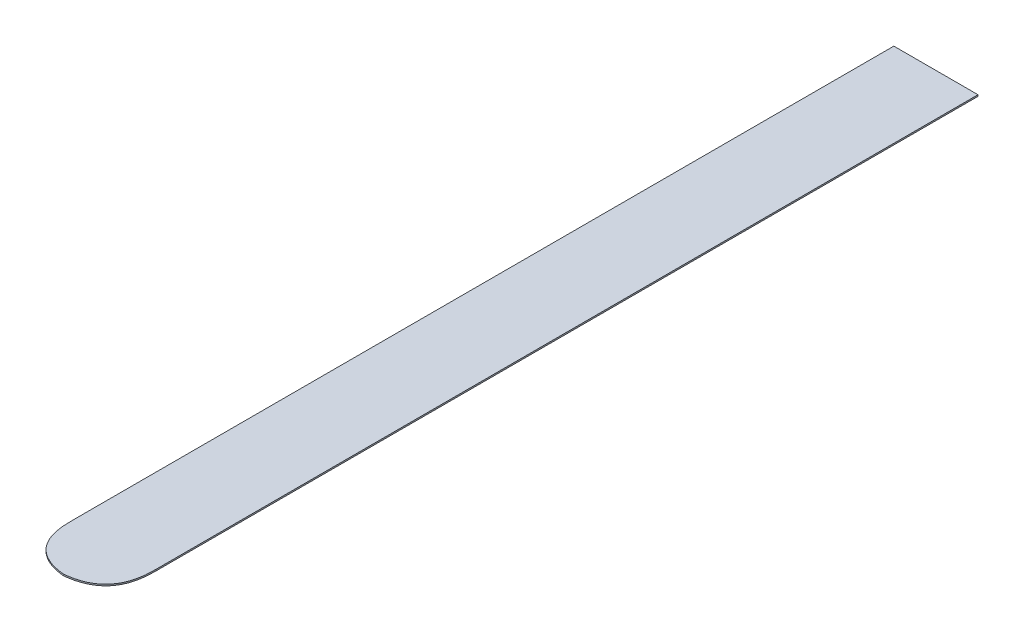
ISO-10303-21;
HEADER;
FILE_DESCRIPTION(('STEP AP214'),'2;1');
FILE_NAME('part.step','',(''),(''),'','','');
FILE_SCHEMA(('AUTOMOTIVE_DESIGN { 1 0 10303 214 1 1 1 1 }'));
ENDSEC;
DATA;
#1=APPLICATION_CONTEXT('core data for automotive mechanical design processes');
#2=APPLICATION_PROTOCOL_DEFINITION('international standard','automotive_design',2000,#1);
#3=PRODUCT_CONTEXT('',#1,'mechanical');
#4=PRODUCT('Part','Part','',(#3));
#5=PRODUCT_RELATED_PRODUCT_CATEGORY('part','',(#4));
#6=PRODUCT_DEFINITION_FORMATION('','',#4);
#7=PRODUCT_DEFINITION_CONTEXT('part definition',#1,'design');
#8=PRODUCT_DEFINITION('design','',#6,#7);
#9=PRODUCT_DEFINITION_SHAPE('','',#8);
#10=(LENGTH_UNIT() NAMED_UNIT(*) SI_UNIT(.MILLI.,.METRE.));
#11=(NAMED_UNIT(*) PLANE_ANGLE_UNIT() SI_UNIT($,.RADIAN.));
#12=(NAMED_UNIT(*) SI_UNIT($,.STERADIAN.) SOLID_ANGLE_UNIT());
#13=UNCERTAINTY_MEASURE_WITH_UNIT(LENGTH_MEASURE(1.E-05),#10,'distance_accuracy_value','');
#14=(GEOMETRIC_REPRESENTATION_CONTEXT(3) GLOBAL_UNCERTAINTY_ASSIGNED_CONTEXT((#13)) GLOBAL_UNIT_ASSIGNED_CONTEXT((#10,
#11,#12)) REPRESENTATION_CONTEXT('',''));
#15=CARTESIAN_POINT('',(0.,0.,0.));
#16=DIRECTION('',(0.,0.,1.));
#17=DIRECTION('',(1.,0.,0.));
#18=AXIS2_PLACEMENT_3D('',#15,#16,#17);
#19=CARTESIAN_POINT('',(2194.56,76.2,-10955.1842125681));
#20=DIRECTION('',(1.,0.,0.));
#21=DIRECTION('',(0.,0.,-1.));
#22=AXIS2_PLACEMENT_3D('',#19,#20,#21);
#23=PLANE('',#22);
#24=DIRECTION('',(0.,0.,1.));
#25=VECTOR('',#24,1.);
#26=CARTESIAN_POINT('',(2194.56,0.,-10955.1842125681));
#27=LINE('',#26,#25);
#28=CARTESIAN_POINT('',(2194.56,0.,-10955.1842125681));
#29=VERTEX_POINT('',#28);
#30=CARTESIAN_POINT('',(2194.56000000001,0.,31899.6957874319));
#31=VERTEX_POINT('',#30);
#32=EDGE_CURVE('E139',#29,#31,#27,.T.);
#33=ORIENTED_EDGE('',*,*,#32,.F.);
#34=DIRECTION('',(0.,-1.,0.));
#35=VECTOR('',#34,1.);
#36=CARTESIAN_POINT('',(2194.56,76.2,-10955.1842125681));
#37=LINE('',#36,#35);
#38=CARTESIAN_POINT('',(2194.56,76.2,-10955.1842125681));
#39=VERTEX_POINT('',#38);
#40=EDGE_CURVE('E11',#39,#29,#37,.T.);
#41=ORIENTED_EDGE('',*,*,#40,.F.);
#42=DIRECTION('',(0.,0.,1.));
#43=VECTOR('',#42,1.);
#44=CARTESIAN_POINT('',(2194.56,76.2,-10955.1842125681));
#45=LINE('',#44,#43);
#46=CARTESIAN_POINT('',(2194.56000000001,76.2,31899.6957874319));
#47=VERTEX_POINT('',#46);
#48=EDGE_CURVE('E109',#39,#47,#45,.T.);
#49=ORIENTED_EDGE('',*,*,#48,.T.);
#50=DIRECTION('',(0.,-1.,0.));
#51=VECTOR('',#50,1.);
#52=CARTESIAN_POINT('',(2194.56000000001,76.2,31899.6957874319));
#53=LINE('',#52,#51);
#54=EDGE_CURVE('E38',#47,#31,#53,.T.);
#55=ORIENTED_EDGE('',*,*,#54,.T.);
#56=EDGE_LOOP('',(#33,#41,#49,#55));
#57=FACE_BOUND('',#56,.T.);
#58=ADVANCED_FACE('F35',(#57),#23,.T.);
#59=CARTESIAN_POINT('',(2194.56,76.2,-10955.1842125681));
#60=DIRECTION('',(0.,0.,1.));
#61=DIRECTION('',(1.,0.,0.));
#62=AXIS2_PLACEMENT_3D('',#59,#60,#61);
#63=PLANE('',#62);
#64=DIRECTION('',(-1.,0.,0.));
#65=VECTOR('',#64,1.);
#66=CARTESIAN_POINT('',(2194.56,0.,-10955.1842125681));
#67=LINE('',#66,#65);
#68=CARTESIAN_POINT('',(-2194.56,0.,-10955.1842125681));
#69=VERTEX_POINT('',#68);
#70=EDGE_CURVE('E71',#29,#69,#67,.T.);
#71=ORIENTED_EDGE('',*,*,#70,.T.);
#72=DIRECTION('',(0.,-1.,0.));
#73=VECTOR('',#72,1.);
#74=CARTESIAN_POINT('',(-2194.56,76.2,-10955.1842125681));
#75=LINE('',#74,#73);
#76=CARTESIAN_POINT('',(-2194.56,76.2,-10955.1842125681));
#77=VERTEX_POINT('',#76);
#78=EDGE_CURVE('E44',#77,#69,#75,.T.);
#79=ORIENTED_EDGE('',*,*,#78,.F.);
#80=DIRECTION('',(-1.,0.,0.));
#81=VECTOR('',#80,1.);
#82=CARTESIAN_POINT('',(2194.56,76.2,-10955.1842125681));
#83=LINE('',#82,#81);
#84=EDGE_CURVE('E93',#39,#77,#83,.T.);
#85=ORIENTED_EDGE('',*,*,#84,.F.);
#86=ORIENTED_EDGE('',*,*,#40,.T.);
#87=EDGE_LOOP('',(#71,#79,#85,#86));
#88=FACE_BOUND('',#87,.T.);
#89=ADVANCED_FACE('F134',(#88),#63,.F.);
#90=CARTESIAN_POINT('',(-2194.56,76.2,-10955.1842125681));
#91=DIRECTION('',(1.,0.,0.));
#92=DIRECTION('',(0.,0.,-1.));
#93=AXIS2_PLACEMENT_3D('',#90,#91,#92);
#94=PLANE('',#93);
#95=DIRECTION('',(0.,0.,1.));
#96=VECTOR('',#95,1.);
#97=CARTESIAN_POINT('',(-2194.56,0.,-10955.1842125681));
#98=LINE('',#97,#96);
#99=CARTESIAN_POINT('',(-2194.55999999999,0.,31899.6957874319));
#100=VERTEX_POINT('',#99);
#101=EDGE_CURVE('E100',#69,#100,#98,.T.);
#102=ORIENTED_EDGE('',*,*,#101,.T.);
#103=DIRECTION('',(0.,-1.,0.));
#104=VECTOR('',#103,1.);
#105=CARTESIAN_POINT('',(-2194.55999999999,76.2,31899.6957874319));
#106=LINE('',#105,#104);
#107=CARTESIAN_POINT('',(-2194.55999999999,76.2,31899.6957874319));
#108=VERTEX_POINT('',#107);
#109=EDGE_CURVE('E97',#108,#100,#106,.T.);
#110=ORIENTED_EDGE('',*,*,#109,.F.);
#111=DIRECTION('',(0.,0.,1.));
#112=VECTOR('',#111,1.);
#113=CARTESIAN_POINT('',(-2194.56,76.2,-10955.1842125681));
#114=LINE('',#113,#112);
#115=EDGE_CURVE('E86',#77,#108,#114,.T.);
#116=ORIENTED_EDGE('',*,*,#115,.F.);
#117=ORIENTED_EDGE('',*,*,#78,.T.);
#118=EDGE_LOOP('',(#102,#110,#116,#117));
#119=FACE_BOUND('',#118,.T.);
#120=ADVANCED_FACE('F98',(#119),#94,.F.);
#121=CARTESIAN_POINT('',(-2194.56,76.2,31899.6957874319));
#122=CARTESIAN_POINT('',(-2243.37870784085,76.2,34319.120962753));
#123=CARTESIAN_POINT('',(0.,76.2,34539.087894));
#124=B_SPLINE_CURVE_WITH_KNOTS('',2,(#121,#122,#123),.UNSPECIFIED.,.F.,.F.,(3,3),(0.,1.),.UNSPECIFIED.);
#125=DIRECTION('',(0.,-1.,0.));
#126=VECTOR('',#125,1.);
#127=SURFACE_OF_LINEAR_EXTRUSION('',#124,#126);
#128=CARTESIAN_POINT('',(-2194.56,0.,31899.6957874319));
#129=CARTESIAN_POINT('',(-2243.37870784085,0.,34319.120962753));
#130=CARTESIAN_POINT('',(0.,0.,34539.087894));
#131=B_SPLINE_CURVE_WITH_KNOTS('',2,(#128,#129,#130),.UNSPECIFIED.,.F.,.F.,(3,3),(0.,1.),.UNSPECIFIED.);
#132=CARTESIAN_POINT('',(0.,0.,34539.087894));
#133=VERTEX_POINT('',#132);
#134=EDGE_CURVE('E144',#100,#133,#131,.T.);
#135=ORIENTED_EDGE('',*,*,#134,.T.);
#136=DIRECTION('',(0.,-1.,0.));
#137=VECTOR('',#136,1.);
#138=CARTESIAN_POINT('',(0.,76.2,34539.087894));
#139=LINE('',#138,#137);
#140=CARTESIAN_POINT('',(0.,76.2,34539.087894));
#141=VERTEX_POINT('',#140);
#142=EDGE_CURVE('E104',#141,#133,#139,.T.);
#143=ORIENTED_EDGE('',*,*,#142,.F.);
#144=EDGE_CURVE('E91',#108,#141,#124,.T.);
#145=ORIENTED_EDGE('',*,*,#144,.F.);
#146=ORIENTED_EDGE('',*,*,#109,.T.);
#147=EDGE_LOOP('',(#135,#143,#145,#146));
#148=FACE_BOUND('',#147,.T.);
#149=ADVANCED_FACE('F106',(#148),#127,.F.);
#150=CARTESIAN_POINT('',(2194.56000000001,76.2,31899.6957874319));
#151=CARTESIAN_POINT('',(2243.37870784086,76.2,34319.120962753));
#152=CARTESIAN_POINT('',(-4.98130138879752E-13,76.2,34539.087894));
#153=B_SPLINE_CURVE_WITH_KNOTS('',2,(#150,#151,#152),.UNSPECIFIED.,.F.,.F.,(3,3),(0.,1.),.UNSPECIFIED.);
#154=DIRECTION('',(0.,-1.,0.));
#155=VECTOR('',#154,1.);
#156=SURFACE_OF_LINEAR_EXTRUSION('',#153,#155);
#157=CARTESIAN_POINT('',(2194.56000000001,0.,31899.6957874319));
#158=CARTESIAN_POINT('',(2243.37870784086,0.,34319.120962753));
#159=CARTESIAN_POINT('',(-4.98130138879752E-13,0.,34539.087894));
#160=B_SPLINE_CURVE_WITH_KNOTS('',2,(#157,#158,#159),.UNSPECIFIED.,.F.,.F.,(3,3),(0.,1.),.UNSPECIFIED.);
#161=EDGE_CURVE('E142',#31,#133,#160,.T.);
#162=ORIENTED_EDGE('',*,*,#161,.F.);
#163=ORIENTED_EDGE('',*,*,#54,.F.);
#164=EDGE_CURVE('E107',#47,#141,#153,.T.);
#165=ORIENTED_EDGE('',*,*,#164,.T.);
#166=ORIENTED_EDGE('',*,*,#142,.T.);
#167=EDGE_LOOP('',(#162,#163,#165,#166));
#168=FACE_BOUND('',#167,.T.);
#169=ADVANCED_FACE('F125',(#168),#156,.T.);
#170=CARTESIAN_POINT('',(1670.32935392043,76.2,33769.2564017345));
#171=DIRECTION('',(0.,1.,0.));
#172=DIRECTION('',(0.,0.,1.));
#173=AXIS2_PLACEMENT_3D('',#170,#171,#172);
#174=PLANE('',#173);
#175=ORIENTED_EDGE('',*,*,#48,.F.);
#176=ORIENTED_EDGE('',*,*,#84,.T.);
#177=ORIENTED_EDGE('',*,*,#115,.T.);
#178=ORIENTED_EDGE('',*,*,#144,.T.);
#179=ORIENTED_EDGE('',*,*,#164,.F.);
#180=EDGE_LOOP('',(#175,#176,#177,#178,#179));
#181=FACE_BOUND('',#180,.T.);
#182=ADVANCED_FACE('F89',(#181),#174,.T.);
#183=CARTESIAN_POINT('',(1670.32935392043,0.,33769.2564017345));
#184=DIRECTION('',(0.,1.,0.));
#185=DIRECTION('',(0.,0.,1.));
#186=AXIS2_PLACEMENT_3D('',#183,#184,#185);
#187=PLANE('',#186);
#188=ORIENTED_EDGE('',*,*,#32,.T.);
#189=ORIENTED_EDGE('',*,*,#161,.T.);
#190=ORIENTED_EDGE('',*,*,#134,.F.);
#191=ORIENTED_EDGE('',*,*,#101,.F.);
#192=ORIENTED_EDGE('',*,*,#70,.F.);
#193=EDGE_LOOP('',(#188,#189,#190,#191,#192));
#194=FACE_BOUND('',#193,.T.);
#195=ADVANCED_FACE('F131',(#194),#187,.F.);
#196=CLOSED_SHELL('',(#58,#89,#120,#149,#169,#182,#195));
#197=MANIFOLD_SOLID_BREP('B2',#196);
#198=ADVANCED_BREP_SHAPE_REPRESENTATION('',(#18,#197),#14);
#199=SHAPE_DEFINITION_REPRESENTATION(#9,#198);
ENDSEC;
END-ISO-10303-21;
